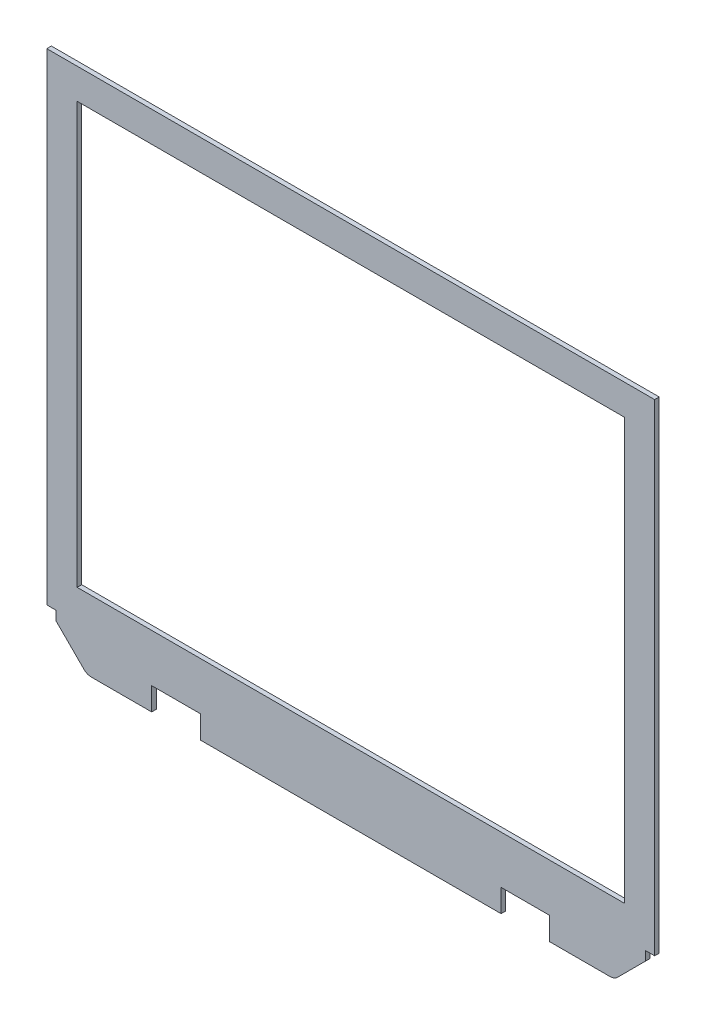
ISO-10303-21;
HEADER;
FILE_DESCRIPTION(('STEP AP214'),'2;1');
FILE_NAME('part.step','',(''),(''),'','','');
FILE_SCHEMA(('AUTOMOTIVE_DESIGN { 1 0 10303 214 1 1 1 1 }'));
ENDSEC;
DATA;
#1=APPLICATION_CONTEXT('core data for automotive mechanical design processes');
#2=APPLICATION_PROTOCOL_DEFINITION('international standard','automotive_design',2000,#1);
#3=PRODUCT_CONTEXT('',#1,'mechanical');
#4=PRODUCT('Part','Part','',(#3));
#5=PRODUCT_RELATED_PRODUCT_CATEGORY('part','',(#4));
#6=PRODUCT_DEFINITION_FORMATION('','',#4);
#7=PRODUCT_DEFINITION_CONTEXT('part definition',#1,'design');
#8=PRODUCT_DEFINITION('design','',#6,#7);
#9=PRODUCT_DEFINITION_SHAPE('','',#8);
#10=(LENGTH_UNIT() NAMED_UNIT(*) SI_UNIT(.MILLI.,.METRE.));
#11=(NAMED_UNIT(*) PLANE_ANGLE_UNIT() SI_UNIT($,.RADIAN.));
#12=(NAMED_UNIT(*) SI_UNIT($,.STERADIAN.) SOLID_ANGLE_UNIT());
#13=UNCERTAINTY_MEASURE_WITH_UNIT(LENGTH_MEASURE(1.E-05),#10,'distance_accuracy_value','');
#14=(GEOMETRIC_REPRESENTATION_CONTEXT(3) GLOBAL_UNCERTAINTY_ASSIGNED_CONTEXT((#13)) GLOBAL_UNIT_ASSIGNED_CONTEXT((#10,
#11,#12)) REPRESENTATION_CONTEXT('',''));
#15=CARTESIAN_POINT('',(0.,0.,0.));
#16=DIRECTION('',(0.,0.,1.));
#17=DIRECTION('',(1.,0.,0.));
#18=AXIS2_PLACEMENT_3D('',#15,#16,#17);
#19=CARTESIAN_POINT('',(-200.,-158.5,3.));
#20=DIRECTION('',(0.,1.,0.));
#21=DIRECTION('',(0.,0.,1.));
#22=AXIS2_PLACEMENT_3D('',#19,#20,#21);
#23=PLANE('',#22);
#24=DIRECTION('',(0.,0.,1.));
#25=VECTOR('',#24,1.);
#26=CARTESIAN_POINT('',(194.,-158.5,0.));
#27=LINE('',#26,#25);
#28=CARTESIAN_POINT('',(194.,-158.5,0.));
#29=VERTEX_POINT('',#28);
#30=CARTESIAN_POINT('',(194.,-158.5,3.));
#31=VERTEX_POINT('',#30);
#32=EDGE_CURVE('E300',#29,#31,#27,.T.);
#33=ORIENTED_EDGE('',*,*,#32,.F.);
#34=DIRECTION('',(1.,0.,0.));
#35=VECTOR('',#34,1.);
#36=CARTESIAN_POINT('',(-200.,-158.5,0.));
#37=LINE('',#36,#35);
#38=CARTESIAN_POINT('',(200.,-158.5,0.));
#39=VERTEX_POINT('',#38);
#40=EDGE_CURVE('E372',#29,#39,#37,.T.);
#41=ORIENTED_EDGE('',*,*,#40,.T.);
#42=DIRECTION('',(0.,0.,-1.));
#43=VECTOR('',#42,1.);
#44=CARTESIAN_POINT('',(200.,-158.5,3.));
#45=LINE('',#44,#43);
#46=CARTESIAN_POINT('',(200.,-158.5,3.));
#47=VERTEX_POINT('',#46);
#48=EDGE_CURVE('E365',#47,#39,#45,.T.);
#49=ORIENTED_EDGE('',*,*,#48,.F.);
#50=DIRECTION('',(1.,0.,0.));
#51=VECTOR('',#50,1.);
#52=CARTESIAN_POINT('',(-200.,-158.5,3.));
#53=LINE('',#52,#51);
#54=EDGE_CURVE('E361',#31,#47,#53,.T.);
#55=ORIENTED_EDGE('',*,*,#54,.F.);
#56=EDGE_LOOP('',(#33,#41,#49,#55));
#57=FACE_BOUND('',#56,.T.);
#58=ADVANCED_FACE('F35',(#57),#23,.F.);
#59=CARTESIAN_POINT('',(0.,0.,3.));
#60=DIRECTION('',(0.,0.,-1.));
#61=DIRECTION('',(-1.,0.,0.));
#62=AXIS2_PLACEMENT_3D('',#59,#60,#61);
#63=PLANE('',#62);
#64=DIRECTION('',(0.,1.,0.));
#65=VECTOR('',#64,1.);
#66=CARTESIAN_POINT('',(200.,-158.5,3.));
#67=LINE('',#66,#65);
#68=CARTESIAN_POINT('',(200.,158.5,3.));
#69=VERTEX_POINT('',#68);
#70=EDGE_CURVE('E353',#47,#69,#67,.T.);
#71=ORIENTED_EDGE('',*,*,#70,.T.);
#72=DIRECTION('',(-1.,0.,0.));
#73=VECTOR('',#72,1.);
#74=CARTESIAN_POINT('',(-200.,158.5,3.));
#75=LINE('',#74,#73);
#76=CARTESIAN_POINT('',(-200.,158.5,3.));
#77=VERTEX_POINT('',#76);
#78=EDGE_CURVE('E356',#69,#77,#75,.T.);
#79=ORIENTED_EDGE('',*,*,#78,.T.);
#80=DIRECTION('',(0.,-1.,0.));
#81=VECTOR('',#80,1.);
#82=CARTESIAN_POINT('',(-200.,-158.5,3.));
#83=LINE('',#82,#81);
#84=CARTESIAN_POINT('',(-200.,-158.5,3.));
#85=VERTEX_POINT('',#84);
#86=EDGE_CURVE('E359',#77,#85,#83,.T.);
#87=ORIENTED_EDGE('',*,*,#86,.T.);
#88=CARTESIAN_POINT('',(-194.,-158.5,3.));
#89=VERTEX_POINT('',#88);
#90=EDGE_CURVE('E362',#85,#89,#53,.T.);
#91=ORIENTED_EDGE('',*,*,#90,.T.);
#92=DIRECTION('',(0.,1.,0.));
#93=VECTOR('',#92,1.);
#94=CARTESIAN_POINT('',(-194.000000000004,-5.38458166943228E-12,3.));
#95=LINE('',#94,#93);
#96=CARTESIAN_POINT('',(-194.,-164.500000000001,3.));
#97=VERTEX_POINT('',#96);
#98=EDGE_CURVE('E50',#97,#89,#95,.T.);
#99=ORIENTED_EDGE('',*,*,#98,.F.);
#100=DIRECTION('',(0.707106781186546,-0.707106781186549,0.));
#101=VECTOR('',#100,1.);
#102=CARTESIAN_POINT('',(-179.250000000001,-179.25,3.));
#103=LINE('',#102,#101);
#104=CARTESIAN_POINT('',(-175.383585865028,-183.116414134973,3.));
#105=VERTEX_POINT('',#104);
#106=EDGE_CURVE('E224',#97,#105,#103,.T.);
#107=ORIENTED_EDGE('',*,*,#106,.T.);
#108=CARTESIAN_POINT('',(-170.604099117637,-178.002070928703,3.));
#109=DIRECTION('',(0.,0.,1.));
#110=DIRECTION('',(1.,0.,0.));
#111=AXIS2_PLACEMENT_3D('',#108,#109,#110);
#112=CIRCLE('',#111,7.00000000000009);
#113=CARTESIAN_POINT('',(-170.433838396721,-185.000000000001,3.));
#114=VERTEX_POINT('',#113);
#115=EDGE_CURVE('E258',#114,#105,#112,.F.);
#116=ORIENTED_EDGE('',*,*,#115,.F.);
#117=DIRECTION('',(-1.,0.,0.));
#118=VECTOR('',#117,1.);
#119=CARTESIAN_POINT('',(1.04052229534968E-12,-185.,3.));
#120=LINE('',#119,#118);
#121=CARTESIAN_POINT('',(-130.955345629465,-185.000000000001,3.));
#122=VERTEX_POINT('',#121);
#123=EDGE_CURVE('E214',#122,#114,#120,.T.);
#124=ORIENTED_EDGE('',*,*,#123,.F.);
#125=DIRECTION('',(0.,1.,0.));
#126=VECTOR('',#125,1.);
#127=CARTESIAN_POINT('',(-130.955345629467,-9.69264266103862E-13,3.));
#128=LINE('',#127,#126);
#129=CARTESIAN_POINT('',(-130.955345629465,-170.000000000001,3.));
#130=VERTEX_POINT('',#129);
#131=EDGE_CURVE('E261',#122,#130,#128,.T.);
#132=ORIENTED_EDGE('',*,*,#131,.T.);
#133=DIRECTION('',(-1.,0.,0.));
#134=VECTOR('',#133,1.);
#135=CARTESIAN_POINT('',(1.17961196366423E-12,-170.,3.));
#136=LINE('',#135,#134);
#137=CARTESIAN_POINT('',(-98.9553456294654,-170.000000000001,3.));
#138=VERTEX_POINT('',#137);
#139=EDGE_CURVE('E264',#138,#130,#136,.T.);
#140=ORIENTED_EDGE('',*,*,#139,.F.);
#141=DIRECTION('',(0.,1.,0.));
#142=VECTOR('',#141,1.);
#143=CARTESIAN_POINT('',(-98.9553456294667,-7.32416687517162E-13,3.));
#144=LINE('',#143,#142);
#145=CARTESIAN_POINT('',(-98.9553456294653,-185.000000000001,3.));
#146=VERTEX_POINT('',#145);
#147=EDGE_CURVE('E267',#146,#138,#144,.T.);
#148=ORIENTED_EDGE('',*,*,#147,.F.);
#149=DIRECTION('',(1.,0.,0.));
#150=VECTOR('',#149,1.);
#151=CARTESIAN_POINT('',(6.22678618064963E-13,-185.,3.));
#152=LINE('',#151,#150);
#153=CARTESIAN_POINT('',(98.9553456294655,-185.,3.));
#154=VERTEX_POINT('',#153);
#155=EDGE_CURVE('E269',#146,#154,#152,.T.);
#156=ORIENTED_EDGE('',*,*,#155,.T.);
#157=DIRECTION('',(0.,1.,0.));
#158=VECTOR('',#157,1.);
#159=CARTESIAN_POINT('',(98.9553456294655,0.,3.));
#160=LINE('',#159,#158);
#161=CARTESIAN_POINT('',(98.9553456294655,-170.,3.));
#162=VERTEX_POINT('',#161);
#163=EDGE_CURVE('E272',#154,#162,#160,.T.);
#164=ORIENTED_EDGE('',*,*,#163,.T.);
#165=DIRECTION('',(1.,0.,0.));
#166=VECTOR('',#165,1.);
#167=CARTESIAN_POINT('',(0.,-170.,3.));
#168=LINE('',#167,#166);
#169=CARTESIAN_POINT('',(130.955345629466,-170.,3.));
#170=VERTEX_POINT('',#169);
#171=EDGE_CURVE('E275',#162,#170,#168,.T.);
#172=ORIENTED_EDGE('',*,*,#171,.T.);
#173=DIRECTION('',(0.,1.,0.));
#174=VECTOR('',#173,1.);
#175=CARTESIAN_POINT('',(130.955345629466,0.,3.));
#176=LINE('',#175,#174);
#177=CARTESIAN_POINT('',(130.955345629466,-185.,3.));
#178=VERTEX_POINT('',#177);
#179=EDGE_CURVE('E278',#178,#170,#176,.T.);
#180=ORIENTED_EDGE('',*,*,#179,.F.);
#181=DIRECTION('',(1.,0.,0.));
#182=VECTOR('',#181,1.);
#183=CARTESIAN_POINT('',(0.,-185.,3.));
#184=LINE('',#183,#182);
#185=CARTESIAN_POINT('',(170.433838396721,-185.,3.));
#186=VERTEX_POINT('',#185);
#187=EDGE_CURVE('E281',#178,#186,#184,.T.);
#188=ORIENTED_EDGE('',*,*,#187,.T.);
#189=CARTESIAN_POINT('',(170.604099117637,-178.002070928702,3.));
#190=DIRECTION('',(0.,0.,1.));
#191=DIRECTION('',(1.,0.,0.));
#192=AXIS2_PLACEMENT_3D('',#189,#190,#191);
#193=CIRCLE('',#192,7.00000000000001);
#194=CARTESIAN_POINT('',(175.383585865028,-183.116414134972,3.));
#195=VERTEX_POINT('',#194);
#196=EDGE_CURVE('E284',#186,#195,#193,.T.);
#197=ORIENTED_EDGE('',*,*,#196,.T.);
#198=DIRECTION('',(-0.707106781186544,-0.707106781186551,0.));
#199=VECTOR('',#198,1.);
#200=CARTESIAN_POINT('',(179.250000000001,-179.249999999999,3.));
#201=LINE('',#200,#199);
#202=CARTESIAN_POINT('',(194.,-164.5,3.));
#203=VERTEX_POINT('',#202);
#204=EDGE_CURVE('E287',#203,#195,#201,.T.);
#205=ORIENTED_EDGE('',*,*,#204,.F.);
#206=DIRECTION('',(0.,1.,0.));
#207=VECTOR('',#206,1.);
#208=CARTESIAN_POINT('',(194.000000000003,-3.58972111295483E-12,3.));
#209=LINE('',#208,#207);
#210=EDGE_CURVE('E290',#203,#31,#209,.T.);
#211=ORIENTED_EDGE('',*,*,#210,.T.);
#212=ORIENTED_EDGE('',*,*,#54,.T.);
#213=EDGE_LOOP('',(#71,#79,#87,#91,#99,#107,#116,#124,#132,#140,#148,#156,#164,#172,#180,#188,
#197,#205,#211,#212));
#214=FACE_BOUND('',#213,.T.);
#215=DIRECTION('',(0.,-1.,0.));
#216=VECTOR('',#215,1.);
#217=CARTESIAN_POINT('',(-180.,-138.5,3.));
#218=LINE('',#217,#216);
#219=CARTESIAN_POINT('',(-180.,138.5,3.));
#220=VERTEX_POINT('',#219);
#221=CARTESIAN_POINT('',(-180.,-138.5,3.));
#222=VERTEX_POINT('',#221);
#223=EDGE_CURVE('E324',#220,#222,#218,.T.);
#224=ORIENTED_EDGE('',*,*,#223,.F.);
#225=DIRECTION('',(-1.,0.,0.));
#226=VECTOR('',#225,1.);
#227=CARTESIAN_POINT('',(-180.,138.5,3.));
#228=LINE('',#227,#226);
#229=CARTESIAN_POINT('',(180.,138.5,3.));
#230=VERTEX_POINT('',#229);
#231=EDGE_CURVE('E331',#230,#220,#228,.T.);
#232=ORIENTED_EDGE('',*,*,#231,.F.);
#233=DIRECTION('',(0.,1.,0.));
#234=VECTOR('',#233,1.);
#235=CARTESIAN_POINT('',(180.,-138.5,3.));
#236=LINE('',#235,#234);
#237=CARTESIAN_POINT('',(180.,-138.5,3.));
#238=VERTEX_POINT('',#237);
#239=EDGE_CURVE('E329',#238,#230,#236,.T.);
#240=ORIENTED_EDGE('',*,*,#239,.F.);
#241=DIRECTION('',(1.,0.,0.));
#242=VECTOR('',#241,1.);
#243=CARTESIAN_POINT('',(-180.,-138.5,3.));
#244=LINE('',#243,#242);
#245=EDGE_CURVE('E326',#222,#238,#244,.T.);
#246=ORIENTED_EDGE('',*,*,#245,.F.);
#247=EDGE_LOOP('',(#224,#232,#240,#246));
#248=FACE_BOUND('',#247,.T.);
#249=ADVANCED_FACE('F393',(#214,#248),#63,.F.);
#250=CARTESIAN_POINT('',(0.,0.,0.));
#251=DIRECTION('',(0.,0.,-1.));
#252=DIRECTION('',(-1.,0.,0.));
#253=AXIS2_PLACEMENT_3D('',#250,#251,#252);
#254=PLANE('',#253);
#255=DIRECTION('',(0.,1.,0.));
#256=VECTOR('',#255,1.);
#257=CARTESIAN_POINT('',(200.,-158.5,0.));
#258=LINE('',#257,#256);
#259=CARTESIAN_POINT('',(200.,158.5,0.));
#260=VERTEX_POINT('',#259);
#261=EDGE_CURVE('E352',#39,#260,#258,.T.);
#262=ORIENTED_EDGE('',*,*,#261,.F.);
#263=ORIENTED_EDGE('',*,*,#40,.F.);
#264=DIRECTION('',(0.,1.,0.));
#265=VECTOR('',#264,1.);
#266=CARTESIAN_POINT('',(194.000000000003,-3.58972111295483E-12,0.));
#267=LINE('',#266,#265);
#268=CARTESIAN_POINT('',(194.,-164.5,0.));
#269=VERTEX_POINT('',#268);
#270=EDGE_CURVE('E253',#269,#29,#267,.T.);
#271=ORIENTED_EDGE('',*,*,#270,.F.);
#272=DIRECTION('',(-0.707106781186544,-0.707106781186551,0.));
#273=VECTOR('',#272,1.);
#274=CARTESIAN_POINT('',(179.250000000001,-179.249999999999,0.));
#275=LINE('',#274,#273);
#276=CARTESIAN_POINT('',(175.383585865028,-183.116414134972,0.));
#277=VERTEX_POINT('',#276);
#278=EDGE_CURVE('E251',#269,#277,#275,.T.);
#279=ORIENTED_EDGE('',*,*,#278,.T.);
#280=CARTESIAN_POINT('',(170.604099117637,-178.002070928702,0.));
#281=DIRECTION('',(0.,0.,1.));
#282=DIRECTION('',(1.,0.,0.));
#283=AXIS2_PLACEMENT_3D('',#280,#281,#282);
#284=CIRCLE('',#283,7.00000000000001);
#285=CARTESIAN_POINT('',(170.433838396721,-185.,0.));
#286=VERTEX_POINT('',#285);
#287=EDGE_CURVE('E248',#286,#277,#284,.T.);
#288=ORIENTED_EDGE('',*,*,#287,.F.);
#289=DIRECTION('',(1.,0.,0.));
#290=VECTOR('',#289,1.);
#291=CARTESIAN_POINT('',(0.,-185.,0.));
#292=LINE('',#291,#290);
#293=CARTESIAN_POINT('',(130.955345629466,-185.,0.));
#294=VERTEX_POINT('',#293);
#295=EDGE_CURVE('E245',#294,#286,#292,.T.);
#296=ORIENTED_EDGE('',*,*,#295,.F.);
#297=DIRECTION('',(0.,1.,0.));
#298=VECTOR('',#297,1.);
#299=CARTESIAN_POINT('',(130.955345629466,0.,0.));
#300=LINE('',#299,#298);
#301=CARTESIAN_POINT('',(130.955345629466,-170.,0.));
#302=VERTEX_POINT('',#301);
#303=EDGE_CURVE('E243',#294,#302,#300,.T.);
#304=ORIENTED_EDGE('',*,*,#303,.T.);
#305=DIRECTION('',(1.,0.,0.));
#306=VECTOR('',#305,1.);
#307=CARTESIAN_POINT('',(0.,-170.,0.));
#308=LINE('',#307,#306);
#309=CARTESIAN_POINT('',(98.9553456294655,-170.,0.));
#310=VERTEX_POINT('',#309);
#311=EDGE_CURVE('E240',#310,#302,#308,.T.);
#312=ORIENTED_EDGE('',*,*,#311,.F.);
#313=DIRECTION('',(0.,1.,0.));
#314=VECTOR('',#313,1.);
#315=CARTESIAN_POINT('',(98.9553456294655,0.,0.));
#316=LINE('',#315,#314);
#317=CARTESIAN_POINT('',(98.9553456294655,-185.,0.));
#318=VERTEX_POINT('',#317);
#319=EDGE_CURVE('E237',#318,#310,#316,.T.);
#320=ORIENTED_EDGE('',*,*,#319,.F.);
#321=DIRECTION('',(1.,0.,0.));
#322=VECTOR('',#321,1.);
#323=CARTESIAN_POINT('',(6.22678618064963E-13,-185.,0.));
#324=LINE('',#323,#322);
#325=CARTESIAN_POINT('',(-98.9553456294653,-185.000000000001,0.));
#326=VERTEX_POINT('',#325);
#327=EDGE_CURVE('E234',#326,#318,#324,.T.);
#328=ORIENTED_EDGE('',*,*,#327,.F.);
#329=DIRECTION('',(0.,1.,0.));
#330=VECTOR('',#329,1.);
#331=CARTESIAN_POINT('',(-98.9553456294667,-7.32416687517162E-13,0.));
#332=LINE('',#331,#330);
#333=CARTESIAN_POINT('',(-98.9553456294654,-170.000000000001,0.));
#334=VERTEX_POINT('',#333);
#335=EDGE_CURVE('E232',#326,#334,#332,.T.);
#336=ORIENTED_EDGE('',*,*,#335,.T.);
#337=DIRECTION('',(-1.,0.,0.));
#338=VECTOR('',#337,1.);
#339=CARTESIAN_POINT('',(1.17961196366423E-12,-170.,0.));
#340=LINE('',#339,#338);
#341=CARTESIAN_POINT('',(-130.955345629465,-170.000000000001,0.));
#342=VERTEX_POINT('',#341);
#343=EDGE_CURVE('E230',#334,#342,#340,.T.);
#344=ORIENTED_EDGE('',*,*,#343,.T.);
#345=DIRECTION('',(0.,1.,0.));
#346=VECTOR('',#345,1.);
#347=CARTESIAN_POINT('',(-130.955345629467,-9.69264266103862E-13,0.));
#348=LINE('',#347,#346);
#349=CARTESIAN_POINT('',(-130.955345629465,-185.000000000001,0.));
#350=VERTEX_POINT('',#349);
#351=EDGE_CURVE('E207',#350,#342,#348,.T.);
#352=ORIENTED_EDGE('',*,*,#351,.F.);
#353=DIRECTION('',(-1.,0.,0.));
#354=VECTOR('',#353,1.);
#355=CARTESIAN_POINT('',(1.04052229534968E-12,-185.,0.));
#356=LINE('',#355,#354);
#357=CARTESIAN_POINT('',(-170.433838396721,-185.000000000001,0.));
#358=VERTEX_POINT('',#357);
#359=EDGE_CURVE('E197',#350,#358,#356,.T.);
#360=ORIENTED_EDGE('',*,*,#359,.T.);
#361=CARTESIAN_POINT('',(-170.604099117637,-178.002070928703,0.));
#362=DIRECTION('',(0.,0.,1.));
#363=DIRECTION('',(1.,0.,0.));
#364=AXIS2_PLACEMENT_3D('',#361,#362,#363);
#365=CIRCLE('',#364,7.00000000000009);
#366=CARTESIAN_POINT('',(-175.383585865028,-183.116414134973,0.));
#367=VERTEX_POINT('',#366);
#368=EDGE_CURVE('E204',#358,#367,#365,.F.);
#369=ORIENTED_EDGE('',*,*,#368,.T.);
#370=DIRECTION('',(0.707106781186546,-0.707106781186549,0.));
#371=VECTOR('',#370,1.);
#372=CARTESIAN_POINT('',(-179.250000000001,-179.25,0.));
#373=LINE('',#372,#371);
#374=CARTESIAN_POINT('',(-194.,-164.500000000001,0.));
#375=VERTEX_POINT('',#374);
#376=EDGE_CURVE('E219',#375,#367,#373,.T.);
#377=ORIENTED_EDGE('',*,*,#376,.F.);
#378=DIRECTION('',(0.,1.,0.));
#379=VECTOR('',#378,1.);
#380=CARTESIAN_POINT('',(-194.000000000004,-5.38458166943228E-12,0.));
#381=LINE('',#380,#379);
#382=CARTESIAN_POINT('',(-194.,-158.5,0.));
#383=VERTEX_POINT('',#382);
#384=EDGE_CURVE('E255',#375,#383,#381,.T.);
#385=ORIENTED_EDGE('',*,*,#384,.T.);
#386=CARTESIAN_POINT('',(-200.,-158.5,0.));
#387=VERTEX_POINT('',#386);
#388=EDGE_CURVE('E357',#387,#383,#37,.T.);
#389=ORIENTED_EDGE('',*,*,#388,.F.);
#390=DIRECTION('',(0.,-1.,0.));
#391=VECTOR('',#390,1.);
#392=CARTESIAN_POINT('',(-200.,-158.5,0.));
#393=LINE('',#392,#391);
#394=CARTESIAN_POINT('',(-200.,158.5,0.));
#395=VERTEX_POINT('',#394);
#396=EDGE_CURVE('E370',#395,#387,#393,.T.);
#397=ORIENTED_EDGE('',*,*,#396,.F.);
#398=DIRECTION('',(-1.,0.,0.));
#399=VECTOR('',#398,1.);
#400=CARTESIAN_POINT('',(-200.,158.5,0.));
#401=LINE('',#400,#399);
#402=EDGE_CURVE('E368',#260,#395,#401,.T.);
#403=ORIENTED_EDGE('',*,*,#402,.F.);
#404=EDGE_LOOP('',(#262,#263,#271,#279,#288,#296,#304,#312,#320,#328,#336,#344,#352,#360,#369,
#377,#385,#389,#397,#403));
#405=FACE_BOUND('',#404,.T.);
#406=DIRECTION('',(-1.,0.,0.));
#407=VECTOR('',#406,1.);
#408=CARTESIAN_POINT('',(-180.,138.5,0.));
#409=LINE('',#408,#407);
#410=CARTESIAN_POINT('',(180.,138.5,0.));
#411=VERTEX_POINT('',#410);
#412=CARTESIAN_POINT('',(-180.,138.5,0.));
#413=VERTEX_POINT('',#412);
#414=EDGE_CURVE('E327',#411,#413,#409,.T.);
#415=ORIENTED_EDGE('',*,*,#414,.T.);
#416=DIRECTION('',(0.,-1.,0.));
#417=VECTOR('',#416,1.);
#418=CARTESIAN_POINT('',(-180.,-138.5,0.));
#419=LINE('',#418,#417);
#420=CARTESIAN_POINT('',(-180.,-138.5,0.));
#421=VERTEX_POINT('',#420);
#422=EDGE_CURVE('E295',#413,#421,#419,.T.);
#423=ORIENTED_EDGE('',*,*,#422,.T.);
#424=DIRECTION('',(1.,0.,0.));
#425=VECTOR('',#424,1.);
#426=CARTESIAN_POINT('',(-180.,-138.5,0.));
#427=LINE('',#426,#425);
#428=CARTESIAN_POINT('',(180.,-138.5,0.));
#429=VERTEX_POINT('',#428);
#430=EDGE_CURVE('E336',#421,#429,#427,.T.);
#431=ORIENTED_EDGE('',*,*,#430,.T.);
#432=DIRECTION('',(0.,1.,0.));
#433=VECTOR('',#432,1.);
#434=CARTESIAN_POINT('',(180.,-138.5,0.));
#435=LINE('',#434,#433);
#436=EDGE_CURVE('E339',#429,#411,#435,.T.);
#437=ORIENTED_EDGE('',*,*,#436,.T.);
#438=EDGE_LOOP('',(#415,#423,#431,#437));
#439=FACE_BOUND('',#438,.T.);
#440=ADVANCED_FACE('F200',(#405,#439),#254,.T.);
#441=CARTESIAN_POINT('',(200.,-158.5,3.));
#442=DIRECTION('',(-1.,0.,0.));
#443=DIRECTION('',(0.,0.,1.));
#444=AXIS2_PLACEMENT_3D('',#441,#442,#443);
#445=PLANE('',#444);
#446=ORIENTED_EDGE('',*,*,#261,.T.);
#447=DIRECTION('',(0.,0.,-1.));
#448=VECTOR('',#447,1.);
#449=CARTESIAN_POINT('',(200.,158.5,3.));
#450=LINE('',#449,#448);
#451=EDGE_CURVE('E11',#69,#260,#450,.T.);
#452=ORIENTED_EDGE('',*,*,#451,.F.);
#453=ORIENTED_EDGE('',*,*,#70,.F.);
#454=ORIENTED_EDGE('',*,*,#48,.T.);
#455=EDGE_LOOP('',(#446,#452,#453,#454));
#456=FACE_BOUND('',#455,.T.);
#457=ADVANCED_FACE('F37',(#456),#445,.F.);
#458=CARTESIAN_POINT('',(-200.,158.5,3.));
#459=DIRECTION('',(0.,-1.,0.));
#460=DIRECTION('',(0.,0.,-1.));
#461=AXIS2_PLACEMENT_3D('',#458,#459,#460);
#462=PLANE('',#461);
#463=ORIENTED_EDGE('',*,*,#402,.T.);
#464=DIRECTION('',(0.,0.,-1.));
#465=VECTOR('',#464,1.);
#466=CARTESIAN_POINT('',(-200.,158.5,3.));
#467=LINE('',#466,#465);
#468=EDGE_CURVE('E43',#77,#395,#467,.T.);
#469=ORIENTED_EDGE('',*,*,#468,.F.);
#470=ORIENTED_EDGE('',*,*,#78,.F.);
#471=ORIENTED_EDGE('',*,*,#451,.T.);
#472=EDGE_LOOP('',(#463,#469,#470,#471));
#473=FACE_BOUND('',#472,.T.);
#474=ADVANCED_FACE('F398',(#473),#462,.F.);
#475=CARTESIAN_POINT('',(-200.,-158.5,3.));
#476=DIRECTION('',(1.,0.,0.));
#477=DIRECTION('',(0.,0.,-1.));
#478=AXIS2_PLACEMENT_3D('',#475,#476,#477);
#479=PLANE('',#478);
#480=ORIENTED_EDGE('',*,*,#396,.T.);
#481=DIRECTION('',(0.,0.,-1.));
#482=VECTOR('',#481,1.);
#483=CARTESIAN_POINT('',(-200.,-158.5,3.));
#484=LINE('',#483,#482);
#485=EDGE_CURVE('E377',#85,#387,#484,.T.);
#486=ORIENTED_EDGE('',*,*,#485,.F.);
#487=ORIENTED_EDGE('',*,*,#86,.F.);
#488=ORIENTED_EDGE('',*,*,#468,.T.);
#489=EDGE_LOOP('',(#480,#486,#487,#488));
#490=FACE_BOUND('',#489,.T.);
#491=ADVANCED_FACE('F384',(#490),#479,.F.);
#492=ORIENTED_EDGE('',*,*,#388,.T.);
#493=DIRECTION('',(0.,0.,1.));
#494=VECTOR('',#493,1.);
#495=CARTESIAN_POINT('',(-194.,-158.5,0.));
#496=LINE('',#495,#494);
#497=EDGE_CURVE('E298',#383,#89,#496,.T.);
#498=ORIENTED_EDGE('',*,*,#497,.T.);
#499=ORIENTED_EDGE('',*,*,#90,.F.);
#500=ORIENTED_EDGE('',*,*,#485,.T.);
#501=EDGE_LOOP('',(#492,#498,#499,#500));
#502=FACE_BOUND('',#501,.T.);
#503=ADVANCED_FACE('F390',(#502),#23,.F.);
#504=CARTESIAN_POINT('',(-180.,-138.5,3.));
#505=DIRECTION('',(1.,0.,0.));
#506=DIRECTION('',(0.,0.,-1.));
#507=AXIS2_PLACEMENT_3D('',#504,#505,#506);
#508=PLANE('',#507);
#509=ORIENTED_EDGE('',*,*,#422,.F.);
#510=DIRECTION('',(0.,0.,-1.));
#511=VECTOR('',#510,1.);
#512=CARTESIAN_POINT('',(-180.,138.5,3.));
#513=LINE('',#512,#511);
#514=EDGE_CURVE('E333',#220,#413,#513,.T.);
#515=ORIENTED_EDGE('',*,*,#514,.F.);
#516=ORIENTED_EDGE('',*,*,#223,.T.);
#517=DIRECTION('',(0.,0.,-1.));
#518=VECTOR('',#517,1.);
#519=CARTESIAN_POINT('',(-180.,-138.5,3.));
#520=LINE('',#519,#518);
#521=EDGE_CURVE('E349',#222,#421,#520,.T.);
#522=ORIENTED_EDGE('',*,*,#521,.T.);
#523=EDGE_LOOP('',(#509,#515,#516,#522));
#524=FACE_BOUND('',#523,.T.);
#525=ADVANCED_FACE('F472',(#524),#508,.T.);
#526=CARTESIAN_POINT('',(-180.,-138.5,3.));
#527=DIRECTION('',(0.,1.,0.));
#528=DIRECTION('',(0.,0.,1.));
#529=AXIS2_PLACEMENT_3D('',#526,#527,#528);
#530=PLANE('',#529);
#531=ORIENTED_EDGE('',*,*,#430,.F.);
#532=ORIENTED_EDGE('',*,*,#521,.F.);
#533=ORIENTED_EDGE('',*,*,#245,.T.);
#534=DIRECTION('',(0.,0.,-1.));
#535=VECTOR('',#534,1.);
#536=CARTESIAN_POINT('',(180.,-138.5,3.));
#537=LINE('',#536,#535);
#538=EDGE_CURVE('E347',#238,#429,#537,.T.);
#539=ORIENTED_EDGE('',*,*,#538,.T.);
#540=EDGE_LOOP('',(#531,#532,#533,#539));
#541=FACE_BOUND('',#540,.T.);
#542=ADVANCED_FACE('F478',(#541),#530,.T.);
#543=CARTESIAN_POINT('',(180.,-138.5,3.));
#544=DIRECTION('',(-1.,0.,0.));
#545=DIRECTION('',(0.,-1.,0.));
#546=AXIS2_PLACEMENT_3D('',#543,#544,#545);
#547=PLANE('',#546);
#548=ORIENTED_EDGE('',*,*,#436,.F.);
#549=ORIENTED_EDGE('',*,*,#538,.F.);
#550=ORIENTED_EDGE('',*,*,#239,.T.);
#551=DIRECTION('',(0.,0.,-1.));
#552=VECTOR('',#551,1.);
#553=CARTESIAN_POINT('',(180.,138.5,3.));
#554=LINE('',#553,#552);
#555=EDGE_CURVE('E58',#230,#411,#554,.T.);
#556=ORIENTED_EDGE('',*,*,#555,.T.);
#557=EDGE_LOOP('',(#548,#549,#550,#556));
#558=FACE_BOUND('',#557,.T.);
#559=ADVANCED_FACE('F496',(#558),#547,.T.);
#560=CARTESIAN_POINT('',(-180.,138.5,3.));
#561=DIRECTION('',(0.,-1.,0.));
#562=DIRECTION('',(1.,0.,0.));
#563=AXIS2_PLACEMENT_3D('',#560,#561,#562);
#564=PLANE('',#563);
#565=ORIENTED_EDGE('',*,*,#414,.F.);
#566=ORIENTED_EDGE('',*,*,#555,.F.);
#567=ORIENTED_EDGE('',*,*,#231,.T.);
#568=ORIENTED_EDGE('',*,*,#514,.T.);
#569=EDGE_LOOP('',(#565,#566,#567,#568));
#570=FACE_BOUND('',#569,.T.);
#571=ADVANCED_FACE('F500',(#570),#564,.T.);
#572=CARTESIAN_POINT('',(-170.604099117637,-178.002070928703,0.));
#573=DIRECTION('',(0.,0.,1.));
#574=DIRECTION('',(1.,0.,0.));
#575=AXIS2_PLACEMENT_3D('',#572,#573,#574);
#576=CYLINDRICAL_SURFACE('',#575,7.00000000000009);
#577=ORIENTED_EDGE('',*,*,#115,.T.);
#578=DIRECTION('',(0.,0.,1.));
#579=VECTOR('',#578,1.);
#580=CARTESIAN_POINT('',(-175.383585865028,-183.116414134973,0.));
#581=LINE('',#580,#579);
#582=EDGE_CURVE('E222',#367,#105,#581,.T.);
#583=ORIENTED_EDGE('',*,*,#582,.F.);
#584=ORIENTED_EDGE('',*,*,#368,.F.);
#585=DIRECTION('',(0.,0.,1.));
#586=VECTOR('',#585,1.);
#587=CARTESIAN_POINT('',(-170.433838396721,-185.000000000001,0.));
#588=LINE('',#587,#586);
#589=EDGE_CURVE('E211',#358,#114,#588,.T.);
#590=ORIENTED_EDGE('',*,*,#589,.T.);
#591=EDGE_LOOP('',(#577,#583,#584,#590));
#592=FACE_BOUND('',#591,.T.);
#593=ADVANCED_FACE('F221',(#592),#576,.T.);
#594=CARTESIAN_POINT('',(-179.250000000001,-179.25,0.));
#595=DIRECTION('',(-0.707106781186548,-0.707106781186546,0.));
#596=DIRECTION('',(0.707106781186546,-0.707106781186549,0.));
#597=AXIS2_PLACEMENT_3D('',#594,#595,#596);
#598=PLANE('',#597);
#599=ORIENTED_EDGE('',*,*,#106,.F.);
#600=DIRECTION('',(0.,0.,1.));
#601=VECTOR('',#600,1.);
#602=CARTESIAN_POINT('',(-194.,-164.500000000001,0.));
#603=LINE('',#602,#601);
#604=EDGE_CURVE('E296',#375,#97,#603,.T.);
#605=ORIENTED_EDGE('',*,*,#604,.F.);
#606=ORIENTED_EDGE('',*,*,#376,.T.);
#607=ORIENTED_EDGE('',*,*,#582,.T.);
#608=EDGE_LOOP('',(#599,#605,#606,#607));
#609=FACE_BOUND('',#608,.T.);
#610=ADVANCED_FACE('F451',(#609),#598,.T.);
#611=CARTESIAN_POINT('',(-194.000000000004,-5.38458166943228E-12,0.));
#612=DIRECTION('',(1.,0.,0.));
#613=DIRECTION('',(0.,1.,0.));
#614=AXIS2_PLACEMENT_3D('',#611,#612,#613);
#615=PLANE('',#614);
#616=ORIENTED_EDGE('',*,*,#98,.T.);
#617=ORIENTED_EDGE('',*,*,#497,.F.);
#618=ORIENTED_EDGE('',*,*,#384,.F.);
#619=ORIENTED_EDGE('',*,*,#604,.T.);
#620=EDGE_LOOP('',(#616,#617,#618,#619));
#621=FACE_BOUND('',#620,.T.);
#622=ADVANCED_FACE('F452',(#621),#615,.F.);
#623=CARTESIAN_POINT('',(194.000000000003,-3.58972111295483E-12,0.));
#624=DIRECTION('',(1.,0.,0.));
#625=DIRECTION('',(0.,1.,0.));
#626=AXIS2_PLACEMENT_3D('',#623,#624,#625);
#627=PLANE('',#626);
#628=ORIENTED_EDGE('',*,*,#210,.F.);
#629=DIRECTION('',(0.,0.,1.));
#630=VECTOR('',#629,1.);
#631=CARTESIAN_POINT('',(194.,-164.5,0.));
#632=LINE('',#631,#630);
#633=EDGE_CURVE('E302',#269,#203,#632,.T.);
#634=ORIENTED_EDGE('',*,*,#633,.F.);
#635=ORIENTED_EDGE('',*,*,#270,.T.);
#636=ORIENTED_EDGE('',*,*,#32,.T.);
#637=EDGE_LOOP('',(#628,#634,#635,#636));
#638=FACE_BOUND('',#637,.T.);
#639=ADVANCED_FACE('F408',(#638),#627,.T.);
#640=CARTESIAN_POINT('',(179.250000000001,-179.249999999999,0.));
#641=DIRECTION('',(-0.70710678118655,0.707106781186544,0.));
#642=DIRECTION('',(-0.707106781186545,-0.707106781186551,0.));
#643=AXIS2_PLACEMENT_3D('',#640,#641,#642);
#644=PLANE('',#643);
#645=ORIENTED_EDGE('',*,*,#204,.T.);
#646=DIRECTION('',(0.,0.,1.));
#647=VECTOR('',#646,1.);
#648=CARTESIAN_POINT('',(175.383585865028,-183.116414134972,0.));
#649=LINE('',#648,#647);
#650=EDGE_CURVE('E304',#277,#195,#649,.T.);
#651=ORIENTED_EDGE('',*,*,#650,.F.);
#652=ORIENTED_EDGE('',*,*,#278,.F.);
#653=ORIENTED_EDGE('',*,*,#633,.T.);
#654=EDGE_LOOP('',(#645,#651,#652,#653));
#655=FACE_BOUND('',#654,.T.);
#656=ADVANCED_FACE('F413',(#655),#644,.F.);
#657=CARTESIAN_POINT('',(170.604099117637,-178.002070928702,0.));
#658=DIRECTION('',(0.,0.,1.));
#659=DIRECTION('',(1.,0.,0.));
#660=AXIS2_PLACEMENT_3D('',#657,#658,#659);
#661=CYLINDRICAL_SURFACE('',#660,7.00000000000001);
#662=ORIENTED_EDGE('',*,*,#196,.F.);
#663=DIRECTION('',(0.,0.,1.));
#664=VECTOR('',#663,1.);
#665=CARTESIAN_POINT('',(170.433838396721,-185.,0.));
#666=LINE('',#665,#664);
#667=EDGE_CURVE('E306',#286,#186,#666,.T.);
#668=ORIENTED_EDGE('',*,*,#667,.F.);
#669=ORIENTED_EDGE('',*,*,#287,.T.);
#670=ORIENTED_EDGE('',*,*,#650,.T.);
#671=EDGE_LOOP('',(#662,#668,#669,#670));
#672=FACE_BOUND('',#671,.T.);
#673=ADVANCED_FACE('F524',(#672),#661,.T.);
#674=CARTESIAN_POINT('',(0.,-185.,0.));
#675=DIRECTION('',(0.,-1.,0.));
#676=DIRECTION('',(0.,0.,-1.));
#677=AXIS2_PLACEMENT_3D('',#674,#675,#676);
#678=PLANE('',#677);
#679=ORIENTED_EDGE('',*,*,#187,.F.);
#680=DIRECTION('',(0.,0.,1.));
#681=VECTOR('',#680,1.);
#682=CARTESIAN_POINT('',(130.955345629466,-185.,0.));
#683=LINE('',#682,#681);
#684=EDGE_CURVE('E308',#294,#178,#683,.T.);
#685=ORIENTED_EDGE('',*,*,#684,.F.);
#686=ORIENTED_EDGE('',*,*,#295,.T.);
#687=ORIENTED_EDGE('',*,*,#667,.T.);
#688=EDGE_LOOP('',(#679,#685,#686,#687));
#689=FACE_BOUND('',#688,.T.);
#690=ADVANCED_FACE('F420',(#689),#678,.T.);
#691=CARTESIAN_POINT('',(130.955345629466,0.,0.));
#692=DIRECTION('',(1.,0.,0.));
#693=DIRECTION('',(0.,0.,-1.));
#694=AXIS2_PLACEMENT_3D('',#691,#692,#693);
#695=PLANE('',#694);
#696=ORIENTED_EDGE('',*,*,#179,.T.);
#697=DIRECTION('',(0.,0.,1.));
#698=VECTOR('',#697,1.);
#699=CARTESIAN_POINT('',(130.955345629466,-170.,0.));
#700=LINE('',#699,#698);
#701=EDGE_CURVE('E310',#302,#170,#700,.T.);
#702=ORIENTED_EDGE('',*,*,#701,.F.);
#703=ORIENTED_EDGE('',*,*,#303,.F.);
#704=ORIENTED_EDGE('',*,*,#684,.T.);
#705=EDGE_LOOP('',(#696,#702,#703,#704));
#706=FACE_BOUND('',#705,.T.);
#707=ADVANCED_FACE('F425',(#706),#695,.F.);
#708=CARTESIAN_POINT('',(0.,-170.,0.));
#709=DIRECTION('',(0.,-1.,0.));
#710=DIRECTION('',(0.,0.,-1.));
#711=AXIS2_PLACEMENT_3D('',#708,#709,#710);
#712=PLANE('',#711);
#713=ORIENTED_EDGE('',*,*,#171,.F.);
#714=DIRECTION('',(0.,0.,1.));
#715=VECTOR('',#714,1.);
#716=CARTESIAN_POINT('',(98.9553456294655,-170.,0.));
#717=LINE('',#716,#715);
#718=EDGE_CURVE('E312',#310,#162,#717,.T.);
#719=ORIENTED_EDGE('',*,*,#718,.F.);
#720=ORIENTED_EDGE('',*,*,#311,.T.);
#721=ORIENTED_EDGE('',*,*,#701,.T.);
#722=EDGE_LOOP('',(#713,#719,#720,#721));
#723=FACE_BOUND('',#722,.T.);
#724=ADVANCED_FACE('F517',(#723),#712,.T.);
#725=CARTESIAN_POINT('',(98.9553456294655,0.,0.));
#726=DIRECTION('',(1.,0.,0.));
#727=DIRECTION('',(0.,0.,-1.));
#728=AXIS2_PLACEMENT_3D('',#725,#726,#727);
#729=PLANE('',#728);
#730=ORIENTED_EDGE('',*,*,#163,.F.);
#731=DIRECTION('',(0.,0.,1.));
#732=VECTOR('',#731,1.);
#733=CARTESIAN_POINT('',(98.9553456294655,-185.,0.));
#734=LINE('',#733,#732);
#735=EDGE_CURVE('E314',#318,#154,#734,.T.);
#736=ORIENTED_EDGE('',*,*,#735,.F.);
#737=ORIENTED_EDGE('',*,*,#319,.T.);
#738=ORIENTED_EDGE('',*,*,#718,.T.);
#739=EDGE_LOOP('',(#730,#736,#737,#738));
#740=FACE_BOUND('',#739,.T.);
#741=ADVANCED_FACE('F432',(#740),#729,.T.);
#742=CARTESIAN_POINT('',(6.22678618064963E-13,-185.,0.));
#743=DIRECTION('',(0.,-1.,0.));
#744=DIRECTION('',(1.,0.,0.));
#745=AXIS2_PLACEMENT_3D('',#742,#743,#744);
#746=PLANE('',#745);
#747=ORIENTED_EDGE('',*,*,#155,.F.);
#748=DIRECTION('',(0.,0.,1.));
#749=VECTOR('',#748,1.);
#750=CARTESIAN_POINT('',(-98.9553456294653,-185.000000000001,0.));
#751=LINE('',#750,#749);
#752=EDGE_CURVE('E316',#326,#146,#751,.T.);
#753=ORIENTED_EDGE('',*,*,#752,.F.);
#754=ORIENTED_EDGE('',*,*,#327,.T.);
#755=ORIENTED_EDGE('',*,*,#735,.T.);
#756=EDGE_LOOP('',(#747,#753,#754,#755));
#757=FACE_BOUND('',#756,.T.);
#758=ADVANCED_FACE('F436',(#757),#746,.T.);
#759=CARTESIAN_POINT('',(-98.9553456294667,-7.32416687517162E-13,0.));
#760=DIRECTION('',(1.,0.,0.));
#761=DIRECTION('',(0.,1.,0.));
#762=AXIS2_PLACEMENT_3D('',#759,#760,#761);
#763=PLANE('',#762);
#764=ORIENTED_EDGE('',*,*,#147,.T.);
#765=DIRECTION('',(0.,0.,1.));
#766=VECTOR('',#765,1.);
#767=CARTESIAN_POINT('',(-98.9553456294654,-170.000000000001,0.));
#768=LINE('',#767,#766);
#769=EDGE_CURVE('E318',#334,#138,#768,.T.);
#770=ORIENTED_EDGE('',*,*,#769,.F.);
#771=ORIENTED_EDGE('',*,*,#335,.F.);
#772=ORIENTED_EDGE('',*,*,#752,.T.);
#773=EDGE_LOOP('',(#764,#770,#771,#772));
#774=FACE_BOUND('',#773,.T.);
#775=ADVANCED_FACE('F442',(#774),#763,.F.);
#776=CARTESIAN_POINT('',(1.17961196366423E-12,-170.,0.));
#777=DIRECTION('',(0.,1.,0.));
#778=DIRECTION('',(-1.,0.,0.));
#779=AXIS2_PLACEMENT_3D('',#776,#777,#778);
#780=PLANE('',#779);
#781=ORIENTED_EDGE('',*,*,#139,.T.);
#782=DIRECTION('',(0.,0.,1.));
#783=VECTOR('',#782,1.);
#784=CARTESIAN_POINT('',(-130.955345629465,-170.000000000001,0.));
#785=LINE('',#784,#783);
#786=EDGE_CURVE('E321',#342,#130,#785,.T.);
#787=ORIENTED_EDGE('',*,*,#786,.F.);
#788=ORIENTED_EDGE('',*,*,#343,.F.);
#789=ORIENTED_EDGE('',*,*,#769,.T.);
#790=EDGE_LOOP('',(#781,#787,#788,#789));
#791=FACE_BOUND('',#790,.T.);
#792=ADVANCED_FACE('F446',(#791),#780,.F.);
#793=CARTESIAN_POINT('',(-130.955345629467,-9.69264266103862E-13,0.));
#794=DIRECTION('',(1.,0.,0.));
#795=DIRECTION('',(0.,1.,0.));
#796=AXIS2_PLACEMENT_3D('',#793,#794,#795);
#797=PLANE('',#796);
#798=ORIENTED_EDGE('',*,*,#131,.F.);
#799=DIRECTION('',(0.,0.,1.));
#800=VECTOR('',#799,1.);
#801=CARTESIAN_POINT('',(-130.955345629465,-185.000000000001,0.));
#802=LINE('',#801,#800);
#803=EDGE_CURVE('E218',#350,#122,#802,.T.);
#804=ORIENTED_EDGE('',*,*,#803,.F.);
#805=ORIENTED_EDGE('',*,*,#351,.T.);
#806=ORIENTED_EDGE('',*,*,#786,.T.);
#807=EDGE_LOOP('',(#798,#804,#805,#806));
#808=FACE_BOUND('',#807,.T.);
#809=ADVANCED_FACE('F449',(#808),#797,.T.);
#810=CARTESIAN_POINT('',(1.04052229534968E-12,-185.,0.));
#811=DIRECTION('',(0.,1.,0.));
#812=DIRECTION('',(-1.,0.,0.));
#813=AXIS2_PLACEMENT_3D('',#810,#811,#812);
#814=PLANE('',#813);
#815=ORIENTED_EDGE('',*,*,#123,.T.);
#816=ORIENTED_EDGE('',*,*,#589,.F.);
#817=ORIENTED_EDGE('',*,*,#359,.F.);
#818=ORIENTED_EDGE('',*,*,#803,.T.);
#819=EDGE_LOOP('',(#815,#816,#817,#818));
#820=FACE_BOUND('',#819,.T.);
#821=ADVANCED_FACE('F212',(#820),#814,.F.);
#822=CLOSED_SHELL('',(#58,#249,#440,#457,#474,#491,#503,#525,#542,#559,#571,#593,#610,#622,#639,
#656,#673,#690,#707,#724,#741,#758,#775,#792,#809,#821));
#823=MANIFOLD_SOLID_BREP('B2',#822);
#824=ADVANCED_BREP_SHAPE_REPRESENTATION('',(#18,#823),#14);
#825=SHAPE_DEFINITION_REPRESENTATION(#9,#824);
ENDSEC;
END-ISO-10303-21;
